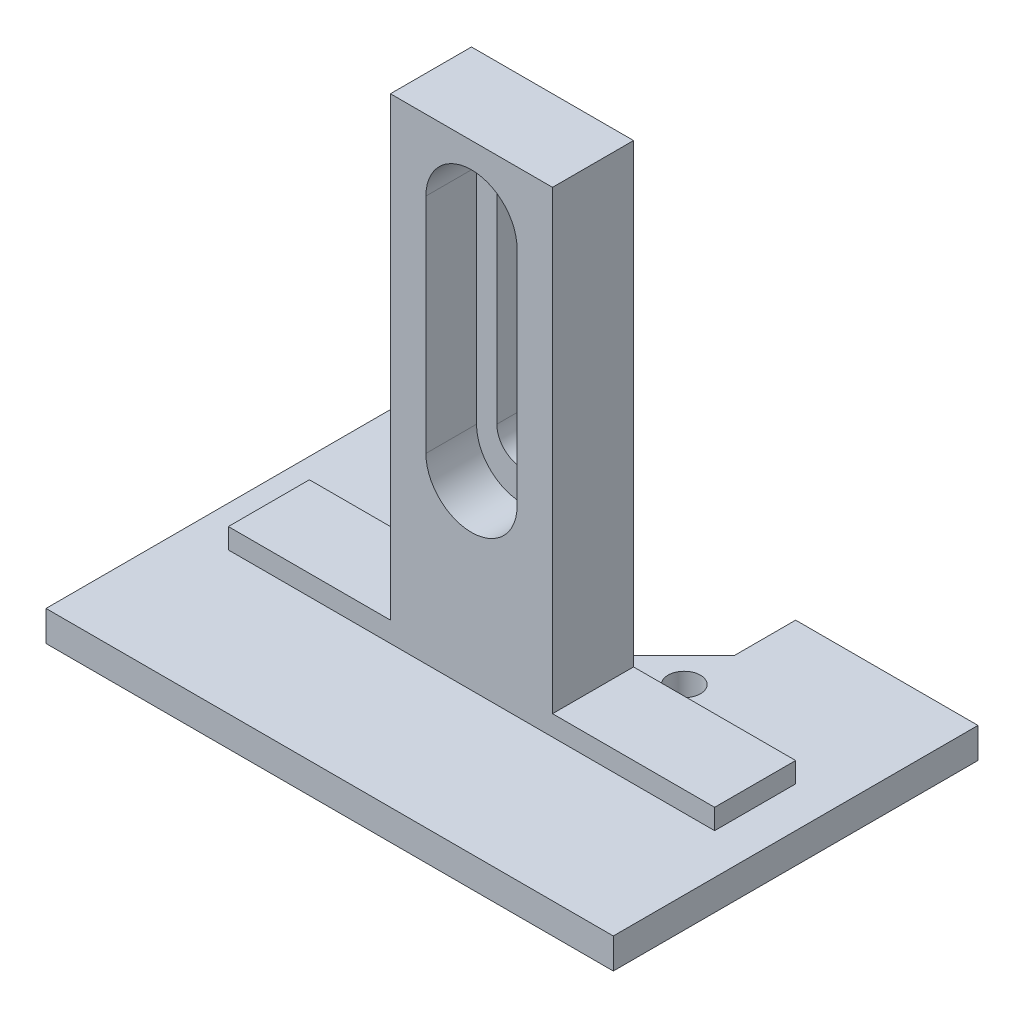
ISO-10303-21;
HEADER;
FILE_DESCRIPTION(('STEP AP214'),'2;1');
FILE_NAME('part.step','',(''),(''),'','','');
FILE_SCHEMA(('AUTOMOTIVE_DESIGN { 1 0 10303 214 1 1 1 1 }'));
ENDSEC;
DATA;
#1=APPLICATION_CONTEXT('core data for automotive mechanical design processes');
#2=APPLICATION_PROTOCOL_DEFINITION('international standard','automotive_design',2000,#1);
#3=PRODUCT_CONTEXT('',#1,'mechanical');
#4=PRODUCT('Part','Part','',(#3));
#5=PRODUCT_RELATED_PRODUCT_CATEGORY('part','',(#4));
#6=PRODUCT_DEFINITION_FORMATION('','',#4);
#7=PRODUCT_DEFINITION_CONTEXT('part definition',#1,'design');
#8=PRODUCT_DEFINITION('design','',#6,#7);
#9=PRODUCT_DEFINITION_SHAPE('','',#8);
#10=(LENGTH_UNIT() NAMED_UNIT(*) SI_UNIT(.MILLI.,.METRE.));
#11=(NAMED_UNIT(*) PLANE_ANGLE_UNIT() SI_UNIT($,.RADIAN.));
#12=(NAMED_UNIT(*) SI_UNIT($,.STERADIAN.) SOLID_ANGLE_UNIT());
#13=UNCERTAINTY_MEASURE_WITH_UNIT(LENGTH_MEASURE(1.E-05),#10,'distance_accuracy_value','');
#14=(GEOMETRIC_REPRESENTATION_CONTEXT(3) GLOBAL_UNCERTAINTY_ASSIGNED_CONTEXT((#13)) GLOBAL_UNIT_ASSIGNED_CONTEXT((#10,
#11,#12)) REPRESENTATION_CONTEXT('',''));
#15=CARTESIAN_POINT('',(0.,0.,0.));
#16=DIRECTION('',(0.,0.,1.));
#17=DIRECTION('',(1.,0.,0.));
#18=AXIS2_PLACEMENT_3D('',#15,#16,#17);
#19=CARTESIAN_POINT('',(0.,39.,-36.));
#20=DIRECTION('',(0.,0.,1.));
#21=DIRECTION('',(1.,0.,0.));
#22=AXIS2_PLACEMENT_3D('',#19,#20,#21);
#23=CYLINDRICAL_SURFACE('',#22,2.5);
#24=CARTESIAN_POINT('',(0.,39.,-19.));
#25=DIRECTION('',(0.,0.,1.));
#26=DIRECTION('',(1.,0.,0.));
#27=AXIS2_PLACEMENT_3D('',#24,#25,#26);
#28=CIRCLE('',#27,2.5);
#29=CARTESIAN_POINT('',(-2.5,39.,-19.));
#30=VERTEX_POINT('',#29);
#31=CARTESIAN_POINT('',(2.5,39.,-19.));
#32=VERTEX_POINT('',#31);
#33=EDGE_CURVE('E262',#30,#32,#28,.F.);
#34=ORIENTED_EDGE('',*,*,#33,.F.);
#35=DIRECTION('',(0.,0.,1.));
#36=VECTOR('',#35,1.);
#37=CARTESIAN_POINT('',(-2.5,39.,-36.));
#38=LINE('',#37,#36);
#39=CARTESIAN_POINT('',(-2.5,39.,-22.));
#40=VERTEX_POINT('',#39);
#41=EDGE_CURVE('E265',#40,#30,#38,.T.);
#42=ORIENTED_EDGE('',*,*,#41,.F.);
#43=CARTESIAN_POINT('',(0.,39.,-22.));
#44=DIRECTION('',(0.,0.,1.));
#45=DIRECTION('',(1.,0.,0.));
#46=AXIS2_PLACEMENT_3D('',#43,#44,#45);
#47=CIRCLE('',#46,2.5);
#48=CARTESIAN_POINT('',(2.5,39.,-22.));
#49=VERTEX_POINT('',#48);
#50=EDGE_CURVE('E50',#49,#40,#47,.T.);
#51=ORIENTED_EDGE('',*,*,#50,.F.);
#52=DIRECTION('',(0.,0.,1.));
#53=VECTOR('',#52,1.);
#54=CARTESIAN_POINT('',(2.5,39.,-36.));
#55=LINE('',#54,#53);
#56=EDGE_CURVE('E266',#49,#32,#55,.T.);
#57=ORIENTED_EDGE('',*,*,#56,.T.);
#58=EDGE_LOOP('',(#34,#42,#51,#57));
#59=FACE_BOUND('',#58,.T.);
#60=ADVANCED_FACE('F41',(#59),#23,.F.);
#61=CARTESIAN_POINT('',(2.5,39.,-36.));
#62=DIRECTION('',(1.,0.,0.));
#63=DIRECTION('',(0.,1.,0.));
#64=AXIS2_PLACEMENT_3D('',#61,#62,#63);
#65=PLANE('',#64);
#66=DIRECTION('',(0.,-1.,0.));
#67=VECTOR('',#66,1.);
#68=CARTESIAN_POINT('',(2.5,39.,-19.));
#69=LINE('',#68,#67);
#70=CARTESIAN_POINT('',(2.5,19.,-19.));
#71=VERTEX_POINT('',#70);
#72=EDGE_CURVE('E259',#32,#71,#69,.T.);
#73=ORIENTED_EDGE('',*,*,#72,.F.);
#74=ORIENTED_EDGE('',*,*,#56,.F.);
#75=DIRECTION('',(0.,1.,0.));
#76=VECTOR('',#75,1.);
#77=CARTESIAN_POINT('',(2.50000000000001,2.,-22.));
#78=LINE('',#77,#76);
#79=CARTESIAN_POINT('',(2.5,19.,-22.));
#80=VERTEX_POINT('',#79);
#81=EDGE_CURVE('E495',#80,#49,#78,.T.);
#82=ORIENTED_EDGE('',*,*,#81,.F.);
#83=DIRECTION('',(0.,0.,1.));
#84=VECTOR('',#83,1.);
#85=CARTESIAN_POINT('',(2.5,19.,-36.));
#86=LINE('',#85,#84);
#87=EDGE_CURVE('E271',#80,#71,#86,.T.);
#88=ORIENTED_EDGE('',*,*,#87,.T.);
#89=EDGE_LOOP('',(#73,#74,#82,#88));
#90=FACE_BOUND('',#89,.T.);
#91=ADVANCED_FACE('F509',(#90),#65,.F.);
#92=CARTESIAN_POINT('',(0.,19.,-36.));
#93=DIRECTION('',(0.,0.,1.));
#94=DIRECTION('',(1.,0.,0.));
#95=AXIS2_PLACEMENT_3D('',#92,#93,#94);
#96=CYLINDRICAL_SURFACE('',#95,2.5);
#97=CARTESIAN_POINT('',(0.,19.,-19.));
#98=DIRECTION('',(0.,0.,1.));
#99=DIRECTION('',(1.,0.,0.));
#100=AXIS2_PLACEMENT_3D('',#97,#98,#99);
#101=CIRCLE('',#100,2.5);
#102=CARTESIAN_POINT('',(-2.49999999999999,19.,-19.));
#103=VERTEX_POINT('',#102);
#104=EDGE_CURVE('E64',#71,#103,#101,.F.);
#105=ORIENTED_EDGE('',*,*,#104,.F.);
#106=ORIENTED_EDGE('',*,*,#87,.F.);
#107=CARTESIAN_POINT('',(0.,19.,-22.));
#108=DIRECTION('',(0.,0.,1.));
#109=DIRECTION('',(1.,0.,0.));
#110=AXIS2_PLACEMENT_3D('',#107,#108,#109);
#111=CIRCLE('',#110,2.5);
#112=CARTESIAN_POINT('',(-2.5,19.,-22.));
#113=VERTEX_POINT('',#112);
#114=EDGE_CURVE('E491',#113,#80,#111,.T.);
#115=ORIENTED_EDGE('',*,*,#114,.F.);
#116=DIRECTION('',(0.,0.,1.));
#117=VECTOR('',#116,1.);
#118=CARTESIAN_POINT('',(-2.49999999999999,19.,-36.));
#119=LINE('',#118,#117);
#120=EDGE_CURVE('E275',#113,#103,#119,.T.);
#121=ORIENTED_EDGE('',*,*,#120,.T.);
#122=EDGE_LOOP('',(#105,#106,#115,#121));
#123=FACE_BOUND('',#122,.T.);
#124=ADVANCED_FACE('F513',(#123),#96,.F.);
#125=CARTESIAN_POINT('',(-2.5,39.,-36.));
#126=DIRECTION('',(-1.,0.,0.));
#127=DIRECTION('',(0.,-1.,0.));
#128=AXIS2_PLACEMENT_3D('',#125,#126,#127);
#129=PLANE('',#128);
#130=DIRECTION('',(0.,1.,0.));
#131=VECTOR('',#130,1.);
#132=CARTESIAN_POINT('',(-2.5,39.,-19.));
#133=LINE('',#132,#131);
#134=EDGE_CURVE('E12',#103,#30,#133,.T.);
#135=ORIENTED_EDGE('',*,*,#134,.F.);
#136=ORIENTED_EDGE('',*,*,#120,.F.);
#137=DIRECTION('',(0.,-1.,0.));
#138=VECTOR('',#137,1.);
#139=CARTESIAN_POINT('',(-2.5,2.,-22.));
#140=LINE('',#139,#138);
#141=EDGE_CURVE('E461',#40,#113,#140,.T.);
#142=ORIENTED_EDGE('',*,*,#141,.F.);
#143=ORIENTED_EDGE('',*,*,#41,.T.);
#144=EDGE_LOOP('',(#135,#136,#142,#143));
#145=FACE_BOUND('',#144,.T.);
#146=ADVANCED_FACE('F516',(#145),#129,.F.);
#147=CARTESIAN_POINT('',(0.,2.,0.));
#148=DIRECTION('',(0.,-1.,0.));
#149=DIRECTION('',(0.,0.,-1.));
#150=AXIS2_PLACEMENT_3D('',#147,#148,#149);
#151=PLANE('',#150);
#152=DIRECTION('',(0.,0.,1.));
#153=VECTOR('',#152,1.);
#154=CARTESIAN_POINT('',(-8.,2.,-14.));
#155=LINE('',#154,#153);
#156=CARTESIAN_POINT('',(-8.,2.,-22.));
#157=VERTEX_POINT('',#156);
#158=CARTESIAN_POINT('',(-8.,2.,-14.));
#159=VERTEX_POINT('',#158);
#160=EDGE_CURVE('E270',#157,#159,#155,.T.);
#161=ORIENTED_EDGE('',*,*,#160,.F.);
#162=DIRECTION('',(-1.,0.,0.));
#163=VECTOR('',#162,1.);
#164=CARTESIAN_POINT('',(-24.,2.,-22.));
#165=LINE('',#164,#163);
#166=CARTESIAN_POINT('',(-24.,2.,-22.));
#167=VERTEX_POINT('',#166);
#168=EDGE_CURVE('E331',#157,#167,#165,.T.);
#169=ORIENTED_EDGE('',*,*,#168,.T.);
#170=DIRECTION('',(0.,0.,1.));
#171=VECTOR('',#170,1.);
#172=CARTESIAN_POINT('',(-24.,2.,-14.));
#173=LINE('',#172,#171);
#174=CARTESIAN_POINT('',(-24.,2.,-14.));
#175=VERTEX_POINT('',#174);
#176=EDGE_CURVE('E319',#167,#175,#173,.T.);
#177=ORIENTED_EDGE('',*,*,#176,.T.);
#178=DIRECTION('',(1.,0.,0.));
#179=VECTOR('',#178,1.);
#180=CARTESIAN_POINT('',(-24.,2.,-14.));
#181=LINE('',#180,#179);
#182=EDGE_CURVE('E325',#175,#159,#181,.T.);
#183=ORIENTED_EDGE('',*,*,#182,.T.);
#184=EDGE_LOOP('',(#161,#169,#177,#183));
#185=FACE_BOUND('',#184,.T.);
#186=ADVANCED_FACE('F518',(#185),#151,.F.);
#187=DIRECTION('',(0.,0.,-1.));
#188=VECTOR('',#187,1.);
#189=CARTESIAN_POINT('',(8.,2.,-14.));
#190=LINE('',#189,#188);
#191=CARTESIAN_POINT('',(8.,2.,-14.));
#192=VERTEX_POINT('',#191);
#193=CARTESIAN_POINT('',(8.,2.,-22.));
#194=VERTEX_POINT('',#193);
#195=EDGE_CURVE('E287',#192,#194,#190,.T.);
#196=ORIENTED_EDGE('',*,*,#195,.F.);
#197=CARTESIAN_POINT('',(24.,2.,-14.));
#198=VERTEX_POINT('',#197);
#199=EDGE_CURVE('E323',#192,#198,#181,.T.);
#200=ORIENTED_EDGE('',*,*,#199,.T.);
#201=DIRECTION('',(0.,0.,-1.));
#202=VECTOR('',#201,1.);
#203=CARTESIAN_POINT('',(24.,2.,-14.));
#204=LINE('',#203,#202);
#205=CARTESIAN_POINT('',(24.,2.,-22.));
#206=VERTEX_POINT('',#205);
#207=EDGE_CURVE('E328',#198,#206,#204,.T.);
#208=ORIENTED_EDGE('',*,*,#207,.T.);
#209=EDGE_CURVE('E332',#206,#194,#165,.T.);
#210=ORIENTED_EDGE('',*,*,#209,.T.);
#211=EDGE_LOOP('',(#196,#200,#208,#210));
#212=FACE_BOUND('',#211,.T.);
#213=ADVANCED_FACE('F524',(#212),#151,.F.);
#214=CARTESIAN_POINT('',(0.,0.,0.));
#215=DIRECTION('',(0.,1.,0.));
#216=DIRECTION('',(0.,0.,1.));
#217=AXIS2_PLACEMENT_3D('',#214,#215,#216);
#218=PLANE('',#217);
#219=CARTESIAN_POINT('',(10.,0.,-25.));
#220=DIRECTION('',(0.,1.,0.));
#221=DIRECTION('',(0.,0.,1.));
#222=AXIS2_PLACEMENT_3D('',#219,#220,#221);
#223=CIRCLE('',#222,1.6);
#224=CARTESIAN_POINT('',(10.,0.,-23.4));
#225=VERTEX_POINT('',#224);
#226=EDGE_CURVE('E361',#225,#225,#223,.T.);
#227=ORIENTED_EDGE('',*,*,#226,.F.);
#228=EDGE_LOOP('',(#227));
#229=FACE_BOUND('',#228,.T.);
#230=CARTESIAN_POINT('',(-10.,0.,-25.));
#231=DIRECTION('',(0.,1.,0.));
#232=DIRECTION('',(0.,0.,1.));
#233=AXIS2_PLACEMENT_3D('',#230,#231,#232);
#234=CIRCLE('',#233,1.6);
#235=CARTESIAN_POINT('',(-10.,0.,-23.4));
#236=VERTEX_POINT('',#235);
#237=EDGE_CURVE('E366',#236,#236,#234,.T.);
#238=ORIENTED_EDGE('',*,*,#237,.F.);
#239=EDGE_LOOP('',(#238));
#240=FACE_BOUND('',#239,.T.);
#241=DIRECTION('',(0.,0.,1.));
#242=VECTOR('',#241,1.);
#243=CARTESIAN_POINT('',(-28.,0.,-36.));
#244=LINE('',#243,#242);
#245=CARTESIAN_POINT('',(-28.,0.,-36.));
#246=VERTEX_POINT('',#245);
#247=CARTESIAN_POINT('',(-28.,0.,0.));
#248=VERTEX_POINT('',#247);
#249=EDGE_CURVE('E374',#246,#248,#244,.T.);
#250=ORIENTED_EDGE('',*,*,#249,.T.);
#251=DIRECTION('',(1.,0.,0.));
#252=VECTOR('',#251,1.);
#253=CARTESIAN_POINT('',(-28.,0.,0.));
#254=LINE('',#253,#252);
#255=CARTESIAN_POINT('',(28.,0.,0.));
#256=VERTEX_POINT('',#255);
#257=EDGE_CURVE('E423',#248,#256,#254,.T.);
#258=ORIENTED_EDGE('',*,*,#257,.T.);
#259=DIRECTION('',(0.,0.,-1.));
#260=VECTOR('',#259,1.);
#261=CARTESIAN_POINT('',(28.,0.,-36.));
#262=LINE('',#261,#260);
#263=CARTESIAN_POINT('',(28.,0.,-36.));
#264=VERTEX_POINT('',#263);
#265=EDGE_CURVE('E427',#256,#264,#262,.T.);
#266=ORIENTED_EDGE('',*,*,#265,.T.);
#267=DIRECTION('',(-1.,0.,0.));
#268=VECTOR('',#267,1.);
#269=CARTESIAN_POINT('',(10.,0.,-36.));
#270=LINE('',#269,#268);
#271=CARTESIAN_POINT('',(10.,0.,-36.));
#272=VERTEX_POINT('',#271);
#273=EDGE_CURVE('E431',#264,#272,#270,.T.);
#274=ORIENTED_EDGE('',*,*,#273,.T.);
#275=DIRECTION('',(0.,0.,1.));
#276=VECTOR('',#275,1.);
#277=CARTESIAN_POINT('',(10.,0.,-36.));
#278=LINE('',#277,#276);
#279=CARTESIAN_POINT('',(10.,0.,-29.9497474683058));
#280=VERTEX_POINT('',#279);
#281=EDGE_CURVE('E435',#272,#280,#278,.T.);
#282=ORIENTED_EDGE('',*,*,#281,.T.);
#283=DIRECTION('',(-0.707106781186549,0.,0.707106781186546));
#284=VECTOR('',#283,1.);
#285=CARTESIAN_POINT('',(10.,0.,-29.9497474683058));
#286=LINE('',#285,#284);
#287=CARTESIAN_POINT('',(3.45025253169416,0.,-23.4));
#288=VERTEX_POINT('',#287);
#289=EDGE_CURVE('E439',#280,#288,#286,.T.);
#290=ORIENTED_EDGE('',*,*,#289,.T.);
#291=DIRECTION('',(-1.,0.,0.));
#292=VECTOR('',#291,1.);
#293=CARTESIAN_POINT('',(-3.45025253169415,0.,-23.4));
#294=LINE('',#293,#292);
#295=CARTESIAN_POINT('',(-3.45025253169415,0.,-23.4));
#296=VERTEX_POINT('',#295);
#297=EDGE_CURVE('E443',#288,#296,#294,.T.);
#298=ORIENTED_EDGE('',*,*,#297,.T.);
#299=DIRECTION('',(-0.707106781186549,0.,-0.707106781186547));
#300=VECTOR('',#299,1.);
#301=CARTESIAN_POINT('',(-10.,0.,-29.9497474683058));
#302=LINE('',#301,#300);
#303=CARTESIAN_POINT('',(-10.,0.,-29.9497474683058));
#304=VERTEX_POINT('',#303);
#305=EDGE_CURVE('E447',#296,#304,#302,.T.);
#306=ORIENTED_EDGE('',*,*,#305,.T.);
#307=DIRECTION('',(0.,0.,-1.));
#308=VECTOR('',#307,1.);
#309=CARTESIAN_POINT('',(-10.,0.,-36.));
#310=LINE('',#309,#308);
#311=CARTESIAN_POINT('',(-10.,0.,-36.));
#312=VERTEX_POINT('',#311);
#313=EDGE_CURVE('E451',#304,#312,#310,.T.);
#314=ORIENTED_EDGE('',*,*,#313,.T.);
#315=DIRECTION('',(-1.,0.,0.));
#316=VECTOR('',#315,1.);
#317=CARTESIAN_POINT('',(-28.,0.,-36.));
#318=LINE('',#317,#316);
#319=EDGE_CURVE('E383',#312,#246,#318,.T.);
#320=ORIENTED_EDGE('',*,*,#319,.T.);
#321=EDGE_LOOP('',(#250,#258,#266,#274,#282,#290,#298,#306,#314,#320));
#322=FACE_BOUND('',#321,.T.);
#323=DIRECTION('',(1.,0.,0.));
#324=VECTOR('',#323,1.);
#325=CARTESIAN_POINT('',(-24.,0.,-14.));
#326=LINE('',#325,#324);
#327=CARTESIAN_POINT('',(-24.,0.,-14.));
#328=VERTEX_POINT('',#327);
#329=CARTESIAN_POINT('',(24.,0.,-14.));
#330=VERTEX_POINT('',#329);
#331=EDGE_CURVE('E339',#328,#330,#326,.T.);
#332=ORIENTED_EDGE('',*,*,#331,.F.);
#333=DIRECTION('',(0.,0.,1.));
#334=VECTOR('',#333,1.);
#335=CARTESIAN_POINT('',(-24.,0.,-14.));
#336=LINE('',#335,#334);
#337=CARTESIAN_POINT('',(-24.,0.,-22.));
#338=VERTEX_POINT('',#337);
#339=EDGE_CURVE('E318',#338,#328,#336,.T.);
#340=ORIENTED_EDGE('',*,*,#339,.F.);
#341=DIRECTION('',(-1.,0.,0.));
#342=VECTOR('',#341,1.);
#343=CARTESIAN_POINT('',(-24.,0.,-22.));
#344=LINE('',#343,#342);
#345=CARTESIAN_POINT('',(24.,0.,-22.));
#346=VERTEX_POINT('',#345);
#347=EDGE_CURVE('E324',#346,#338,#344,.T.);
#348=ORIENTED_EDGE('',*,*,#347,.F.);
#349=DIRECTION('',(0.,0.,-1.));
#350=VECTOR('',#349,1.);
#351=CARTESIAN_POINT('',(24.,0.,-14.));
#352=LINE('',#351,#350);
#353=EDGE_CURVE('E342',#330,#346,#352,.T.);
#354=ORIENTED_EDGE('',*,*,#353,.F.);
#355=EDGE_LOOP('',(#332,#340,#348,#354));
#356=FACE_BOUND('',#355,.T.);
#357=ADVANCED_FACE('F572',(#229,#240,#322,#356),#218,.T.);
#358=CARTESIAN_POINT('',(-28.,-3.,-36.));
#359=DIRECTION('',(-1.,0.,0.));
#360=DIRECTION('',(0.,0.,1.));
#361=AXIS2_PLACEMENT_3D('',#358,#359,#360);
#362=PLANE('',#361);
#363=ORIENTED_EDGE('',*,*,#249,.F.);
#364=DIRECTION('',(0.,1.,0.));
#365=VECTOR('',#364,1.);
#366=CARTESIAN_POINT('',(-28.,-3.,-36.));
#367=LINE('',#366,#365);
#368=CARTESIAN_POINT('',(-28.,-3.,-36.));
#369=VERTEX_POINT('',#368);
#370=EDGE_CURVE('E458',#369,#246,#367,.T.);
#371=ORIENTED_EDGE('',*,*,#370,.F.);
#372=DIRECTION('',(0.,0.,1.));
#373=VECTOR('',#372,1.);
#374=CARTESIAN_POINT('',(-28.,-3.,-36.));
#375=LINE('',#374,#373);
#376=CARTESIAN_POINT('',(-28.,-3.,0.));
#377=VERTEX_POINT('',#376);
#378=EDGE_CURVE('E378',#369,#377,#375,.T.);
#379=ORIENTED_EDGE('',*,*,#378,.T.);
#380=DIRECTION('',(0.,1.,0.));
#381=VECTOR('',#380,1.);
#382=CARTESIAN_POINT('',(-28.,-3.,0.));
#383=LINE('',#382,#381);
#384=EDGE_CURVE('E419',#377,#248,#383,.T.);
#385=ORIENTED_EDGE('',*,*,#384,.T.);
#386=EDGE_LOOP('',(#363,#371,#379,#385));
#387=FACE_BOUND('',#386,.T.);
#388=ADVANCED_FACE('F43',(#387),#362,.T.);
#389=CARTESIAN_POINT('',(-28.,-3.,-36.));
#390=DIRECTION('',(0.,0.,-1.));
#391=DIRECTION('',(-1.,0.,0.));
#392=AXIS2_PLACEMENT_3D('',#389,#390,#391);
#393=PLANE('',#392);
#394=ORIENTED_EDGE('',*,*,#319,.F.);
#395=DIRECTION('',(0.,1.,0.));
#396=VECTOR('',#395,1.);
#397=CARTESIAN_POINT('',(-10.,-3.,-36.));
#398=LINE('',#397,#396);
#399=CARTESIAN_POINT('',(-10.,-3.,-36.));
#400=VERTEX_POINT('',#399);
#401=EDGE_CURVE('E462',#400,#312,#398,.T.);
#402=ORIENTED_EDGE('',*,*,#401,.F.);
#403=DIRECTION('',(-1.,0.,0.));
#404=VECTOR('',#403,1.);
#405=CARTESIAN_POINT('',(-28.,-3.,-36.));
#406=LINE('',#405,#404);
#407=EDGE_CURVE('E415',#400,#369,#406,.T.);
#408=ORIENTED_EDGE('',*,*,#407,.T.);
#409=ORIENTED_EDGE('',*,*,#370,.T.);
#410=EDGE_LOOP('',(#394,#402,#408,#409));
#411=FACE_BOUND('',#410,.T.);
#412=ADVANCED_FACE('F576',(#411),#393,.T.);
#413=CARTESIAN_POINT('',(-10.,-3.,-36.));
#414=DIRECTION('',(1.,0.,0.));
#415=DIRECTION('',(0.,0.,-1.));
#416=AXIS2_PLACEMENT_3D('',#413,#414,#415);
#417=PLANE('',#416);
#418=ORIENTED_EDGE('',*,*,#313,.F.);
#419=DIRECTION('',(0.,1.,0.));
#420=VECTOR('',#419,1.);
#421=CARTESIAN_POINT('',(-10.,-3.,-29.9497474683058));
#422=LINE('',#421,#420);
#423=CARTESIAN_POINT('',(-10.,-3.,-29.9497474683058));
#424=VERTEX_POINT('',#423);
#425=EDGE_CURVE('E465',#424,#304,#422,.T.);
#426=ORIENTED_EDGE('',*,*,#425,.F.);
#427=DIRECTION('',(0.,0.,-1.));
#428=VECTOR('',#427,1.);
#429=CARTESIAN_POINT('',(-10.,-3.,-36.));
#430=LINE('',#429,#428);
#431=EDGE_CURVE('E411',#424,#400,#430,.T.);
#432=ORIENTED_EDGE('',*,*,#431,.T.);
#433=ORIENTED_EDGE('',*,*,#401,.T.);
#434=EDGE_LOOP('',(#418,#426,#432,#433));
#435=FACE_BOUND('',#434,.T.);
#436=ADVANCED_FACE('F579',(#435),#417,.T.);
#437=CARTESIAN_POINT('',(-10.,-3.,-29.9497474683058));
#438=DIRECTION('',(0.707106781186546,0.,-0.707106781186548));
#439=DIRECTION('',(-0.707106781186549,0.,-0.707106781186547));
#440=AXIS2_PLACEMENT_3D('',#437,#438,#439);
#441=PLANE('',#440);
#442=ORIENTED_EDGE('',*,*,#305,.F.);
#443=DIRECTION('',(0.,1.,0.));
#444=VECTOR('',#443,1.);
#445=CARTESIAN_POINT('',(-3.45025253169415,-3.,-23.4));
#446=LINE('',#445,#444);
#447=CARTESIAN_POINT('',(-3.45025253169415,-3.,-23.4));
#448=VERTEX_POINT('',#447);
#449=EDGE_CURVE('E468',#448,#296,#446,.T.);
#450=ORIENTED_EDGE('',*,*,#449,.F.);
#451=DIRECTION('',(-0.707106781186549,0.,-0.707106781186547));
#452=VECTOR('',#451,1.);
#453=CARTESIAN_POINT('',(-10.,-3.,-29.9497474683058));
#454=LINE('',#453,#452);
#455=EDGE_CURVE('E407',#448,#424,#454,.T.);
#456=ORIENTED_EDGE('',*,*,#455,.T.);
#457=ORIENTED_EDGE('',*,*,#425,.T.);
#458=EDGE_LOOP('',(#442,#450,#456,#457));
#459=FACE_BOUND('',#458,.T.);
#460=ADVANCED_FACE('F583',(#459),#441,.T.);
#461=CARTESIAN_POINT('',(-3.45025253169415,-3.,-23.4));
#462=DIRECTION('',(0.,0.,-1.));
#463=DIRECTION('',(-1.,0.,0.));
#464=AXIS2_PLACEMENT_3D('',#461,#462,#463);
#465=PLANE('',#464);
#466=ORIENTED_EDGE('',*,*,#297,.F.);
#467=DIRECTION('',(0.,1.,0.));
#468=VECTOR('',#467,1.);
#469=CARTESIAN_POINT('',(3.45025253169416,-3.,-23.4));
#470=LINE('',#469,#468);
#471=CARTESIAN_POINT('',(3.45025253169416,-3.,-23.4));
#472=VERTEX_POINT('',#471);
#473=EDGE_CURVE('E471',#472,#288,#470,.T.);
#474=ORIENTED_EDGE('',*,*,#473,.F.);
#475=DIRECTION('',(-1.,0.,0.));
#476=VECTOR('',#475,1.);
#477=CARTESIAN_POINT('',(-3.45025253169415,-3.,-23.4));
#478=LINE('',#477,#476);
#479=EDGE_CURVE('E403',#472,#448,#478,.T.);
#480=ORIENTED_EDGE('',*,*,#479,.T.);
#481=ORIENTED_EDGE('',*,*,#449,.T.);
#482=EDGE_LOOP('',(#466,#474,#480,#481));
#483=FACE_BOUND('',#482,.T.);
#484=ADVANCED_FACE('F587',(#483),#465,.T.);
#485=CARTESIAN_POINT('',(10.,-3.,-29.9497474683058));
#486=DIRECTION('',(-0.707106781186546,0.,-0.707106781186549));
#487=DIRECTION('',(-0.707106781186549,0.,0.707106781186546));
#488=AXIS2_PLACEMENT_3D('',#485,#486,#487);
#489=PLANE('',#488);
#490=ORIENTED_EDGE('',*,*,#289,.F.);
#491=DIRECTION('',(0.,1.,0.));
#492=VECTOR('',#491,1.);
#493=CARTESIAN_POINT('',(10.,-3.,-29.9497474683058));
#494=LINE('',#493,#492);
#495=CARTESIAN_POINT('',(10.,-3.,-29.9497474683058));
#496=VERTEX_POINT('',#495);
#497=EDGE_CURVE('E474',#496,#280,#494,.T.);
#498=ORIENTED_EDGE('',*,*,#497,.F.);
#499=DIRECTION('',(-0.707106781186549,0.,0.707106781186546));
#500=VECTOR('',#499,1.);
#501=CARTESIAN_POINT('',(10.,-3.,-29.9497474683058));
#502=LINE('',#501,#500);
#503=EDGE_CURVE('E399',#496,#472,#502,.T.);
#504=ORIENTED_EDGE('',*,*,#503,.T.);
#505=ORIENTED_EDGE('',*,*,#473,.T.);
#506=EDGE_LOOP('',(#490,#498,#504,#505));
#507=FACE_BOUND('',#506,.T.);
#508=ADVANCED_FACE('F591',(#507),#489,.T.);
#509=CARTESIAN_POINT('',(10.,-3.,-36.));
#510=DIRECTION('',(-1.,0.,0.));
#511=DIRECTION('',(0.,0.,1.));
#512=AXIS2_PLACEMENT_3D('',#509,#510,#511);
#513=PLANE('',#512);
#514=ORIENTED_EDGE('',*,*,#281,.F.);
#515=DIRECTION('',(0.,1.,0.));
#516=VECTOR('',#515,1.);
#517=CARTESIAN_POINT('',(10.,-3.,-36.));
#518=LINE('',#517,#516);
#519=CARTESIAN_POINT('',(10.,-3.,-36.));
#520=VERTEX_POINT('',#519);
#521=EDGE_CURVE('E477',#520,#272,#518,.T.);
#522=ORIENTED_EDGE('',*,*,#521,.F.);
#523=DIRECTION('',(0.,0.,1.));
#524=VECTOR('',#523,1.);
#525=CARTESIAN_POINT('',(10.,-3.,-36.));
#526=LINE('',#525,#524);
#527=EDGE_CURVE('E395',#520,#496,#526,.T.);
#528=ORIENTED_EDGE('',*,*,#527,.T.);
#529=ORIENTED_EDGE('',*,*,#497,.T.);
#530=EDGE_LOOP('',(#514,#522,#528,#529));
#531=FACE_BOUND('',#530,.T.);
#532=ADVANCED_FACE('F595',(#531),#513,.T.);
#533=CARTESIAN_POINT('',(10.,-3.,-36.));
#534=DIRECTION('',(0.,0.,-1.));
#535=DIRECTION('',(-1.,0.,0.));
#536=AXIS2_PLACEMENT_3D('',#533,#534,#535);
#537=PLANE('',#536);
#538=ORIENTED_EDGE('',*,*,#273,.F.);
#539=DIRECTION('',(0.,1.,0.));
#540=VECTOR('',#539,1.);
#541=CARTESIAN_POINT('',(28.,-3.,-36.));
#542=LINE('',#541,#540);
#543=CARTESIAN_POINT('',(28.,-3.,-36.));
#544=VERTEX_POINT('',#543);
#545=EDGE_CURVE('E480',#544,#264,#542,.T.);
#546=ORIENTED_EDGE('',*,*,#545,.F.);
#547=DIRECTION('',(-1.,0.,0.));
#548=VECTOR('',#547,1.);
#549=CARTESIAN_POINT('',(10.,-3.,-36.));
#550=LINE('',#549,#548);
#551=EDGE_CURVE('E391',#544,#520,#550,.T.);
#552=ORIENTED_EDGE('',*,*,#551,.T.);
#553=ORIENTED_EDGE('',*,*,#521,.T.);
#554=EDGE_LOOP('',(#538,#546,#552,#553));
#555=FACE_BOUND('',#554,.T.);
#556=ADVANCED_FACE('F599',(#555),#537,.T.);
#557=CARTESIAN_POINT('',(28.,-3.,-36.));
#558=DIRECTION('',(1.,0.,0.));
#559=DIRECTION('',(0.,0.,-1.));
#560=AXIS2_PLACEMENT_3D('',#557,#558,#559);
#561=PLANE('',#560);
#562=ORIENTED_EDGE('',*,*,#265,.F.);
#563=DIRECTION('',(0.,1.,0.));
#564=VECTOR('',#563,1.);
#565=CARTESIAN_POINT('',(28.,-3.,0.));
#566=LINE('',#565,#564);
#567=CARTESIAN_POINT('',(28.,-3.,0.));
#568=VERTEX_POINT('',#567);
#569=EDGE_CURVE('E483',#568,#256,#566,.T.);
#570=ORIENTED_EDGE('',*,*,#569,.F.);
#571=DIRECTION('',(0.,0.,-1.));
#572=VECTOR('',#571,1.);
#573=CARTESIAN_POINT('',(28.,-3.,-36.));
#574=LINE('',#573,#572);
#575=EDGE_CURVE('E387',#568,#544,#574,.T.);
#576=ORIENTED_EDGE('',*,*,#575,.T.);
#577=ORIENTED_EDGE('',*,*,#545,.T.);
#578=EDGE_LOOP('',(#562,#570,#576,#577));
#579=FACE_BOUND('',#578,.T.);
#580=ADVANCED_FACE('F603',(#579),#561,.T.);
#581=CARTESIAN_POINT('',(-28.,-3.,0.));
#582=DIRECTION('',(0.,0.,1.));
#583=DIRECTION('',(1.,0.,0.));
#584=AXIS2_PLACEMENT_3D('',#581,#582,#583);
#585=PLANE('',#584);
#586=ORIENTED_EDGE('',*,*,#257,.F.);
#587=ORIENTED_EDGE('',*,*,#384,.F.);
#588=DIRECTION('',(1.,0.,0.));
#589=VECTOR('',#588,1.);
#590=CARTESIAN_POINT('',(-28.,-3.,0.));
#591=LINE('',#590,#589);
#592=EDGE_CURVE('E382',#377,#568,#591,.T.);
#593=ORIENTED_EDGE('',*,*,#592,.T.);
#594=ORIENTED_EDGE('',*,*,#569,.T.);
#595=EDGE_LOOP('',(#586,#587,#593,#594));
#596=FACE_BOUND('',#595,.T.);
#597=ADVANCED_FACE('F570',(#596),#585,.T.);
#598=CARTESIAN_POINT('',(0.,-3.,0.));
#599=DIRECTION('',(0.,1.,0.));
#600=DIRECTION('',(0.,0.,1.));
#601=AXIS2_PLACEMENT_3D('',#598,#599,#600);
#602=PLANE('',#601);
#603=CARTESIAN_POINT('',(10.,-3.,-25.));
#604=DIRECTION('',(0.,1.,0.));
#605=DIRECTION('',(0.,0.,1.));
#606=AXIS2_PLACEMENT_3D('',#603,#604,#605);
#607=CIRCLE('',#606,1.6);
#608=CARTESIAN_POINT('',(10.,-3.,-23.4));
#609=VERTEX_POINT('',#608);
#610=EDGE_CURVE('E362',#609,#609,#607,.T.);
#611=ORIENTED_EDGE('',*,*,#610,.T.);
#612=EDGE_LOOP('',(#611));
#613=FACE_BOUND('',#612,.T.);
#614=CARTESIAN_POINT('',(-10.,-3.,-25.));
#615=DIRECTION('',(0.,1.,0.));
#616=DIRECTION('',(0.,0.,1.));
#617=AXIS2_PLACEMENT_3D('',#614,#615,#616);
#618=CIRCLE('',#617,1.6);
#619=CARTESIAN_POINT('',(-10.,-3.,-23.4));
#620=VERTEX_POINT('',#619);
#621=EDGE_CURVE('E370',#620,#620,#618,.T.);
#622=ORIENTED_EDGE('',*,*,#621,.T.);
#623=EDGE_LOOP('',(#622));
#624=FACE_BOUND('',#623,.T.);
#625=ORIENTED_EDGE('',*,*,#378,.F.);
#626=ORIENTED_EDGE('',*,*,#407,.F.);
#627=ORIENTED_EDGE('',*,*,#431,.F.);
#628=ORIENTED_EDGE('',*,*,#455,.F.);
#629=ORIENTED_EDGE('',*,*,#479,.F.);
#630=ORIENTED_EDGE('',*,*,#503,.F.);
#631=ORIENTED_EDGE('',*,*,#527,.F.);
#632=ORIENTED_EDGE('',*,*,#551,.F.);
#633=ORIENTED_EDGE('',*,*,#575,.F.);
#634=ORIENTED_EDGE('',*,*,#592,.F.);
#635=EDGE_LOOP('',(#625,#626,#627,#628,#629,#630,#631,#632,#633,#634));
#636=FACE_BOUND('',#635,.T.);
#637=ADVANCED_FACE('F566',(#613,#624,#636),#602,.F.);
#638=CARTESIAN_POINT('',(-10.,-3.,-25.));
#639=DIRECTION('',(0.,1.,0.));
#640=DIRECTION('',(0.,0.,1.));
#641=AXIS2_PLACEMENT_3D('',#638,#639,#640);
#642=CYLINDRICAL_SURFACE('',#641,1.6);
#643=ORIENTED_EDGE('',*,*,#621,.F.);
#644=EDGE_LOOP('',(#643));
#645=FACE_BOUND('',#644,.T.);
#646=ORIENTED_EDGE('',*,*,#237,.T.);
#647=EDGE_LOOP('',(#646));
#648=FACE_BOUND('',#647,.T.);
#649=ADVANCED_FACE('F562',(#645,#648),#642,.F.);
#650=CARTESIAN_POINT('',(10.,-3.,-25.));
#651=DIRECTION('',(0.,1.,0.));
#652=DIRECTION('',(0.,0.,1.));
#653=AXIS2_PLACEMENT_3D('',#650,#651,#652);
#654=CYLINDRICAL_SURFACE('',#653,1.6);
#655=ORIENTED_EDGE('',*,*,#610,.F.);
#656=EDGE_LOOP('',(#655));
#657=FACE_BOUND('',#656,.T.);
#658=ORIENTED_EDGE('',*,*,#226,.T.);
#659=EDGE_LOOP('',(#658));
#660=FACE_BOUND('',#659,.T.);
#661=ADVANCED_FACE('F558',(#657,#660),#654,.F.);
#662=CARTESIAN_POINT('',(-24.,2.,-14.));
#663=DIRECTION('',(1.,0.,0.));
#664=DIRECTION('',(0.,0.,-1.));
#665=AXIS2_PLACEMENT_3D('',#662,#663,#664);
#666=PLANE('',#665);
#667=ORIENTED_EDGE('',*,*,#339,.T.);
#668=DIRECTION('',(0.,-1.,0.));
#669=VECTOR('',#668,1.);
#670=CARTESIAN_POINT('',(-24.,2.,-14.));
#671=LINE('',#670,#669);
#672=EDGE_CURVE('E358',#175,#328,#671,.T.);
#673=ORIENTED_EDGE('',*,*,#672,.F.);
#674=ORIENTED_EDGE('',*,*,#176,.F.);
#675=DIRECTION('',(0.,-1.,0.));
#676=VECTOR('',#675,1.);
#677=CARTESIAN_POINT('',(-24.,2.,-22.));
#678=LINE('',#677,#676);
#679=EDGE_CURVE('E335',#167,#338,#678,.T.);
#680=ORIENTED_EDGE('',*,*,#679,.T.);
#681=EDGE_LOOP('',(#667,#673,#674,#680));
#682=FACE_BOUND('',#681,.T.);
#683=ADVANCED_FACE('F555',(#682),#666,.F.);
#684=CARTESIAN_POINT('',(-24.,2.,-14.));
#685=DIRECTION('',(0.,0.,-1.));
#686=DIRECTION('',(-1.,0.,0.));
#687=AXIS2_PLACEMENT_3D('',#684,#685,#686);
#688=PLANE('',#687);
#689=DIRECTION('',(0.,-1.,0.));
#690=VECTOR('',#689,1.);
#691=CARTESIAN_POINT('',(-4.5,40.,-14.));
#692=LINE('',#691,#690);
#693=CARTESIAN_POINT('',(-4.5,40.,-14.));
#694=VERTEX_POINT('',#693);
#695=CARTESIAN_POINT('',(-4.49999999999999,18.,-14.));
#696=VERTEX_POINT('',#695);
#697=EDGE_CURVE('E231',#694,#696,#692,.T.);
#698=ORIENTED_EDGE('',*,*,#697,.F.);
#699=CARTESIAN_POINT('',(0.,40.,-14.));
#700=DIRECTION('',(0.,0.,1.));
#701=DIRECTION('',(1.,0.,0.));
#702=AXIS2_PLACEMENT_3D('',#699,#700,#701);
#703=CIRCLE('',#702,4.5);
#704=CARTESIAN_POINT('',(4.5,40.,-14.));
#705=VERTEX_POINT('',#704);
#706=EDGE_CURVE('E57',#705,#694,#703,.T.);
#707=ORIENTED_EDGE('',*,*,#706,.F.);
#708=DIRECTION('',(0.,1.,0.));
#709=VECTOR('',#708,1.);
#710=CARTESIAN_POINT('',(4.5,40.,-14.));
#711=LINE('',#710,#709);
#712=CARTESIAN_POINT('',(4.5,18.,-14.));
#713=VERTEX_POINT('',#712);
#714=EDGE_CURVE('E239',#713,#705,#711,.T.);
#715=ORIENTED_EDGE('',*,*,#714,.F.);
#716=CARTESIAN_POINT('',(0.,18.,-14.));
#717=DIRECTION('',(0.,0.,1.));
#718=DIRECTION('',(1.,0.,0.));
#719=AXIS2_PLACEMENT_3D('',#716,#717,#718);
#720=CIRCLE('',#719,4.5);
#721=EDGE_CURVE('E220',#696,#713,#720,.T.);
#722=ORIENTED_EDGE('',*,*,#721,.F.);
#723=EDGE_LOOP('',(#698,#707,#715,#722));
#724=FACE_BOUND('',#723,.T.);
#725=ORIENTED_EDGE('',*,*,#331,.T.);
#726=DIRECTION('',(0.,-1.,0.));
#727=VECTOR('',#726,1.);
#728=CARTESIAN_POINT('',(24.,2.,-14.));
#729=LINE('',#728,#727);
#730=EDGE_CURVE('E354',#198,#330,#729,.T.);
#731=ORIENTED_EDGE('',*,*,#730,.F.);
#732=ORIENTED_EDGE('',*,*,#199,.F.);
#733=DIRECTION('',(0.,-1.,0.));
#734=VECTOR('',#733,1.);
#735=CARTESIAN_POINT('',(8.,47.,-14.));
#736=LINE('',#735,#734);
#737=CARTESIAN_POINT('',(8.,47.,-14.));
#738=VERTEX_POINT('',#737);
#739=EDGE_CURVE('E310',#738,#192,#736,.T.);
#740=ORIENTED_EDGE('',*,*,#739,.F.);
#741=DIRECTION('',(1.,0.,0.));
#742=VECTOR('',#741,1.);
#743=CARTESIAN_POINT('',(-8.,47.,-14.));
#744=LINE('',#743,#742);
#745=CARTESIAN_POINT('',(-8.,47.,-14.));
#746=VERTEX_POINT('',#745);
#747=EDGE_CURVE('E286',#746,#738,#744,.T.);
#748=ORIENTED_EDGE('',*,*,#747,.F.);
#749=DIRECTION('',(0.,-1.,0.));
#750=VECTOR('',#749,1.);
#751=CARTESIAN_POINT('',(-8.,47.,-14.));
#752=LINE('',#751,#750);
#753=EDGE_CURVE('E314',#746,#159,#752,.T.);
#754=ORIENTED_EDGE('',*,*,#753,.T.);
#755=ORIENTED_EDGE('',*,*,#182,.F.);
#756=ORIENTED_EDGE('',*,*,#672,.T.);
#757=EDGE_LOOP('',(#725,#731,#732,#740,#748,#754,#755,#756));
#758=FACE_BOUND('',#757,.T.);
#759=ADVANCED_FACE('F236',(#724,#758),#688,.F.);
#760=CARTESIAN_POINT('',(24.,2.,-14.));
#761=DIRECTION('',(-1.,0.,0.));
#762=DIRECTION('',(0.,0.,1.));
#763=AXIS2_PLACEMENT_3D('',#760,#761,#762);
#764=PLANE('',#763);
#765=ORIENTED_EDGE('',*,*,#353,.T.);
#766=DIRECTION('',(0.,-1.,0.));
#767=VECTOR('',#766,1.);
#768=CARTESIAN_POINT('',(24.,2.,-22.));
#769=LINE('',#768,#767);
#770=EDGE_CURVE('E351',#206,#346,#769,.T.);
#771=ORIENTED_EDGE('',*,*,#770,.F.);
#772=ORIENTED_EDGE('',*,*,#207,.F.);
#773=ORIENTED_EDGE('',*,*,#730,.T.);
#774=EDGE_LOOP('',(#765,#771,#772,#773));
#775=FACE_BOUND('',#774,.T.);
#776=ADVANCED_FACE('F549',(#775),#764,.F.);
#777=CARTESIAN_POINT('',(-24.,2.,-22.));
#778=DIRECTION('',(0.,0.,1.));
#779=DIRECTION('',(1.,0.,0.));
#780=AXIS2_PLACEMENT_3D('',#777,#778,#779);
#781=PLANE('',#780);
#782=ORIENTED_EDGE('',*,*,#81,.T.);
#783=ORIENTED_EDGE('',*,*,#50,.T.);
#784=ORIENTED_EDGE('',*,*,#141,.T.);
#785=ORIENTED_EDGE('',*,*,#114,.T.);
#786=EDGE_LOOP('',(#782,#783,#784,#785));
#787=FACE_BOUND('',#786,.T.);
#788=ORIENTED_EDGE('',*,*,#347,.T.);
#789=ORIENTED_EDGE('',*,*,#679,.F.);
#790=ORIENTED_EDGE('',*,*,#168,.F.);
#791=DIRECTION('',(0.,-1.,0.));
#792=VECTOR('',#791,1.);
#793=CARTESIAN_POINT('',(-8.,47.,-22.));
#794=LINE('',#793,#792);
#795=CARTESIAN_POINT('',(-8.,47.,-22.));
#796=VERTEX_POINT('',#795);
#797=EDGE_CURVE('E296',#796,#157,#794,.T.);
#798=ORIENTED_EDGE('',*,*,#797,.F.);
#799=DIRECTION('',(-1.,0.,0.));
#800=VECTOR('',#799,1.);
#801=CARTESIAN_POINT('',(-8.,47.,-22.));
#802=LINE('',#801,#800);
#803=CARTESIAN_POINT('',(8.,47.,-22.));
#804=VERTEX_POINT('',#803);
#805=EDGE_CURVE('E293',#804,#796,#802,.T.);
#806=ORIENTED_EDGE('',*,*,#805,.F.);
#807=DIRECTION('',(0.,-1.,0.));
#808=VECTOR('',#807,1.);
#809=CARTESIAN_POINT('',(8.,47.,-22.));
#810=LINE('',#809,#808);
#811=EDGE_CURVE('E306',#804,#194,#810,.T.);
#812=ORIENTED_EDGE('',*,*,#811,.T.);
#813=ORIENTED_EDGE('',*,*,#209,.F.);
#814=ORIENTED_EDGE('',*,*,#770,.T.);
#815=EDGE_LOOP('',(#788,#789,#790,#798,#806,#812,#813,#814));
#816=FACE_BOUND('',#815,.T.);
#817=ADVANCED_FACE('F501',(#787,#816),#781,.F.);
#818=CARTESIAN_POINT('',(-8.,47.,-14.));
#819=DIRECTION('',(1.,0.,0.));
#820=DIRECTION('',(0.,0.,-1.));
#821=AXIS2_PLACEMENT_3D('',#818,#819,#820);
#822=PLANE('',#821);
#823=ORIENTED_EDGE('',*,*,#160,.T.);
#824=ORIENTED_EDGE('',*,*,#753,.F.);
#825=DIRECTION('',(0.,0.,1.));
#826=VECTOR('',#825,1.);
#827=CARTESIAN_POINT('',(-8.,47.,-14.));
#828=LINE('',#827,#826);
#829=EDGE_CURVE('E282',#796,#746,#828,.T.);
#830=ORIENTED_EDGE('',*,*,#829,.F.);
#831=ORIENTED_EDGE('',*,*,#797,.T.);
#832=EDGE_LOOP('',(#823,#824,#830,#831));
#833=FACE_BOUND('',#832,.T.);
#834=ADVANCED_FACE('F542',(#833),#822,.F.);
#835=CARTESIAN_POINT('',(8.,47.,-14.));
#836=DIRECTION('',(-1.,0.,0.));
#837=DIRECTION('',(0.,0.,1.));
#838=AXIS2_PLACEMENT_3D('',#835,#836,#837);
#839=PLANE('',#838);
#840=ORIENTED_EDGE('',*,*,#195,.T.);
#841=ORIENTED_EDGE('',*,*,#811,.F.);
#842=DIRECTION('',(0.,0.,-1.));
#843=VECTOR('',#842,1.);
#844=CARTESIAN_POINT('',(8.,47.,-14.));
#845=LINE('',#844,#843);
#846=EDGE_CURVE('E290',#738,#804,#845,.T.);
#847=ORIENTED_EDGE('',*,*,#846,.F.);
#848=ORIENTED_EDGE('',*,*,#739,.T.);
#849=EDGE_LOOP('',(#840,#841,#847,#848));
#850=FACE_BOUND('',#849,.T.);
#851=ADVANCED_FACE('F538',(#850),#839,.F.);
#852=CARTESIAN_POINT('',(0.,47.,0.));
#853=DIRECTION('',(0.,-1.,0.));
#854=DIRECTION('',(0.,0.,-1.));
#855=AXIS2_PLACEMENT_3D('',#852,#853,#854);
#856=PLANE('',#855);
#857=ORIENTED_EDGE('',*,*,#829,.T.);
#858=ORIENTED_EDGE('',*,*,#747,.T.);
#859=ORIENTED_EDGE('',*,*,#846,.T.);
#860=ORIENTED_EDGE('',*,*,#805,.T.);
#861=EDGE_LOOP('',(#857,#858,#859,#860));
#862=FACE_BOUND('',#861,.T.);
#863=ADVANCED_FACE('F535',(#862),#856,.F.);
#864=CARTESIAN_POINT('',(-24.,2.,-19.));
#865=DIRECTION('',(0.,0.,1.));
#866=DIRECTION('',(1.,0.,0.));
#867=AXIS2_PLACEMENT_3D('',#864,#865,#866);
#868=PLANE('',#867);
#869=CARTESIAN_POINT('',(0.,40.,-19.));
#870=DIRECTION('',(0.,0.,1.));
#871=DIRECTION('',(1.,0.,0.));
#872=AXIS2_PLACEMENT_3D('',#869,#870,#871);
#873=CIRCLE('',#872,4.5);
#874=CARTESIAN_POINT('',(-4.5,40.,-19.));
#875=VERTEX_POINT('',#874);
#876=CARTESIAN_POINT('',(4.5,40.,-19.));
#877=VERTEX_POINT('',#876);
#878=EDGE_CURVE('E256',#875,#877,#873,.F.);
#879=ORIENTED_EDGE('',*,*,#878,.F.);
#880=DIRECTION('',(0.,1.,0.));
#881=VECTOR('',#880,1.);
#882=CARTESIAN_POINT('',(-4.5,40.,-19.));
#883=LINE('',#882,#881);
#884=CARTESIAN_POINT('',(-4.49999999999999,18.,-19.));
#885=VERTEX_POINT('',#884);
#886=EDGE_CURVE('E253',#885,#875,#883,.T.);
#887=ORIENTED_EDGE('',*,*,#886,.F.);
#888=CARTESIAN_POINT('',(0.,18.,-19.));
#889=DIRECTION('',(0.,0.,1.));
#890=DIRECTION('',(1.,0.,0.));
#891=AXIS2_PLACEMENT_3D('',#888,#889,#890);
#892=CIRCLE('',#891,4.5);
#893=CARTESIAN_POINT('',(4.5,18.,-19.));
#894=VERTEX_POINT('',#893);
#895=EDGE_CURVE('E223',#894,#885,#892,.F.);
#896=ORIENTED_EDGE('',*,*,#895,.F.);
#897=DIRECTION('',(0.,-1.,0.));
#898=VECTOR('',#897,1.);
#899=CARTESIAN_POINT('',(4.5,40.,-19.));
#900=LINE('',#899,#898);
#901=EDGE_CURVE('E826',#877,#894,#900,.T.);
#902=ORIENTED_EDGE('',*,*,#901,.F.);
#903=EDGE_LOOP('',(#879,#887,#896,#902));
#904=FACE_BOUND('',#903,.T.);
#905=ORIENTED_EDGE('',*,*,#33,.T.);
#906=ORIENTED_EDGE('',*,*,#72,.T.);
#907=ORIENTED_EDGE('',*,*,#104,.T.);
#908=ORIENTED_EDGE('',*,*,#134,.T.);
#909=EDGE_LOOP('',(#905,#906,#907,#908));
#910=FACE_BOUND('',#909,.T.);
#911=ADVANCED_FACE('F511',(#904,#910),#868,.T.);
#912=CARTESIAN_POINT('',(0.,40.,-54.2800247831379));
#913=DIRECTION('',(0.,0.,1.));
#914=DIRECTION('',(1.,0.,0.));
#915=AXIS2_PLACEMENT_3D('',#912,#913,#914);
#916=CYLINDRICAL_SURFACE('',#915,4.5);
#917=ORIENTED_EDGE('',*,*,#878,.T.);
#918=DIRECTION('',(0.,0.,1.));
#919=VECTOR('',#918,1.);
#920=CARTESIAN_POINT('',(4.5,40.,-54.2800247831379));
#921=LINE('',#920,#919);
#922=EDGE_CURVE('E246',#877,#705,#921,.T.);
#923=ORIENTED_EDGE('',*,*,#922,.T.);
#924=ORIENTED_EDGE('',*,*,#706,.T.);
#925=DIRECTION('',(0.,0.,1.));
#926=VECTOR('',#925,1.);
#927=CARTESIAN_POINT('',(-4.5,40.,-54.2800247831379));
#928=LINE('',#927,#926);
#929=EDGE_CURVE('E228',#875,#694,#928,.T.);
#930=ORIENTED_EDGE('',*,*,#929,.F.);
#931=EDGE_LOOP('',(#917,#923,#924,#930));
#932=FACE_BOUND('',#931,.T.);
#933=ADVANCED_FACE('F785',(#932),#916,.F.);
#934=CARTESIAN_POINT('',(4.5,40.,-54.2800247831379));
#935=DIRECTION('',(1.,0.,0.));
#936=DIRECTION('',(0.,1.,0.));
#937=AXIS2_PLACEMENT_3D('',#934,#935,#936);
#938=PLANE('',#937);
#939=ORIENTED_EDGE('',*,*,#901,.T.);
#940=DIRECTION('',(0.,0.,1.));
#941=VECTOR('',#940,1.);
#942=CARTESIAN_POINT('',(4.5,18.,-54.2800247831379));
#943=LINE('',#942,#941);
#944=EDGE_CURVE('E227',#894,#713,#943,.T.);
#945=ORIENTED_EDGE('',*,*,#944,.T.);
#946=ORIENTED_EDGE('',*,*,#714,.T.);
#947=ORIENTED_EDGE('',*,*,#922,.F.);
#948=EDGE_LOOP('',(#939,#945,#946,#947));
#949=FACE_BOUND('',#948,.T.);
#950=ADVANCED_FACE('F795',(#949),#938,.F.);
#951=CARTESIAN_POINT('',(0.,18.,-54.2800247831379));
#952=DIRECTION('',(0.,0.,1.));
#953=DIRECTION('',(1.,0.,0.));
#954=AXIS2_PLACEMENT_3D('',#951,#952,#953);
#955=CYLINDRICAL_SURFACE('',#954,4.5);
#956=ORIENTED_EDGE('',*,*,#895,.T.);
#957=DIRECTION('',(0.,0.,1.));
#958=VECTOR('',#957,1.);
#959=CARTESIAN_POINT('',(-4.49999999999999,18.,-54.2800247831379));
#960=LINE('',#959,#958);
#961=EDGE_CURVE('E215',#885,#696,#960,.T.);
#962=ORIENTED_EDGE('',*,*,#961,.T.);
#963=ORIENTED_EDGE('',*,*,#721,.T.);
#964=ORIENTED_EDGE('',*,*,#944,.F.);
#965=EDGE_LOOP('',(#956,#962,#963,#964));
#966=FACE_BOUND('',#965,.T.);
#967=ADVANCED_FACE('F217',(#966),#955,.F.);
#968=CARTESIAN_POINT('',(-4.5,40.,-54.2800247831379));
#969=DIRECTION('',(-1.,0.,0.));
#970=DIRECTION('',(0.,-1.,0.));
#971=AXIS2_PLACEMENT_3D('',#968,#969,#970);
#972=PLANE('',#971);
#973=ORIENTED_EDGE('',*,*,#886,.T.);
#974=ORIENTED_EDGE('',*,*,#929,.T.);
#975=ORIENTED_EDGE('',*,*,#697,.T.);
#976=ORIENTED_EDGE('',*,*,#961,.F.);
#977=EDGE_LOOP('',(#973,#974,#975,#976));
#978=FACE_BOUND('',#977,.T.);
#979=ADVANCED_FACE('F232',(#978),#972,.F.);
#980=CLOSED_SHELL('',(#60,#91,#124,#146,#186,#213,#357,#388,#412,#436,#460,#484,#508,#532,#556,
#580,#597,#637,#649,#661,#683,#759,#776,#817,#834,#851,#863,#911,#933,#950,#967,#979));
#981=MANIFOLD_SOLID_BREP('B2',#980);
#982=ADVANCED_BREP_SHAPE_REPRESENTATION('',(#18,#981),#14);
#983=SHAPE_DEFINITION_REPRESENTATION(#9,#982);
ENDSEC;
END-ISO-10303-21;
